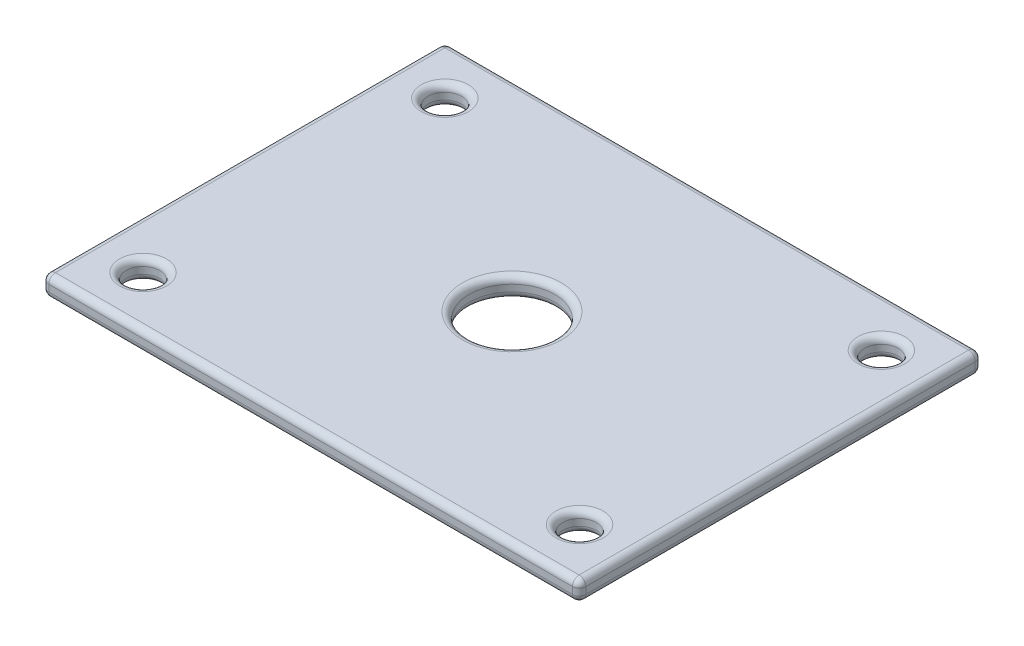
ISO-10303-21;
HEADER;
FILE_DESCRIPTION(('STEP AP214'),'2;1');
FILE_NAME('part.step','',(''),(''),'','','');
FILE_SCHEMA(('AUTOMOTIVE_DESIGN { 1 0 10303 214 1 1 1 1 }'));
ENDSEC;
DATA;
#1=APPLICATION_CONTEXT('core data for automotive mechanical design processes');
#2=APPLICATION_PROTOCOL_DEFINITION('international standard','automotive_design',2000,#1);
#3=PRODUCT_CONTEXT('',#1,'mechanical');
#4=PRODUCT('Part','Part','',(#3));
#5=PRODUCT_RELATED_PRODUCT_CATEGORY('part','',(#4));
#6=PRODUCT_DEFINITION_FORMATION('','',#4);
#7=PRODUCT_DEFINITION_CONTEXT('part definition',#1,'design');
#8=PRODUCT_DEFINITION('design','',#6,#7);
#9=PRODUCT_DEFINITION_SHAPE('','',#8);
#10=(LENGTH_UNIT() NAMED_UNIT(*) SI_UNIT(.MILLI.,.METRE.));
#11=(NAMED_UNIT(*) PLANE_ANGLE_UNIT() SI_UNIT($,.RADIAN.));
#12=(NAMED_UNIT(*) SI_UNIT($,.STERADIAN.) SOLID_ANGLE_UNIT());
#13=UNCERTAINTY_MEASURE_WITH_UNIT(LENGTH_MEASURE(1.E-05),#10,'distance_accuracy_value','');
#14=(GEOMETRIC_REPRESENTATION_CONTEXT(3) GLOBAL_UNCERTAINTY_ASSIGNED_CONTEXT((#13)) GLOBAL_UNIT_ASSIGNED_CONTEXT((#10,
#11,#12)) REPRESENTATION_CONTEXT('',''));
#15=CARTESIAN_POINT('',(0.,0.,0.));
#16=DIRECTION('',(0.,0.,1.));
#17=DIRECTION('',(1.,0.,0.));
#18=AXIS2_PLACEMENT_3D('',#15,#16,#17);
#19=CARTESIAN_POINT('',(-25.8676480428237,3.,-8.16326530612245));
#20=DIRECTION('',(1.,0.,0.));
#21=DIRECTION('',(0.,0.,-1.));
#22=AXIS2_PLACEMENT_3D('',#19,#20,#21);
#23=PLANE('',#22);
#24=DIRECTION('',(0.,0.,1.));
#25=VECTOR('',#24,1.);
#26=CARTESIAN_POINT('',(-25.8676480428237,2.,-8.16326530612245));
#27=LINE('',#26,#25);
#28=CARTESIAN_POINT('',(-25.8676480428236,2.,50.8367346938775));
#29=VERTEX_POINT('',#28);
#30=CARTESIAN_POINT('',(-25.8676480428237,2.,-7.16326530612245));
#31=VERTEX_POINT('',#30);
#32=EDGE_CURVE('E239',#29,#31,#27,.F.);
#33=ORIENTED_EDGE('',*,*,#32,.T.);
#34=DIRECTION('',(0.,-1.,0.));
#35=VECTOR('',#34,1.);
#36=CARTESIAN_POINT('',(-25.8676480428237,3.,-7.16326530612245));
#37=LINE('',#36,#35);
#38=CARTESIAN_POINT('',(-25.8676480428237,1.,-7.16326530612245));
#39=VERTEX_POINT('',#38);
#40=EDGE_CURVE('E246',#31,#39,#37,.T.);
#41=ORIENTED_EDGE('',*,*,#40,.T.);
#42=DIRECTION('',(0.,0.,1.));
#43=VECTOR('',#42,1.);
#44=CARTESIAN_POINT('',(-25.8676480428237,1.,-8.16326530612245));
#45=LINE('',#44,#43);
#46=CARTESIAN_POINT('',(-25.8676480428236,1.,50.8367346938775));
#47=VERTEX_POINT('',#46);
#48=EDGE_CURVE('E242',#39,#47,#45,.T.);
#49=ORIENTED_EDGE('',*,*,#48,.T.);
#50=DIRECTION('',(0.,-1.,0.));
#51=VECTOR('',#50,1.);
#52=CARTESIAN_POINT('',(-25.8676480428236,3.,50.8367346938775));
#53=LINE('',#52,#51);
#54=EDGE_CURVE('E236',#47,#29,#53,.F.);
#55=ORIENTED_EDGE('',*,*,#54,.T.);
#56=EDGE_LOOP('',(#33,#41,#49,#55));
#57=FACE_BOUND('',#56,.T.);
#58=ADVANCED_FACE('F45',(#57),#23,.F.);
#59=CARTESIAN_POINT('',(-25.8676480428236,3.,51.8367346938775));
#60=DIRECTION('',(0.,0.,-1.));
#61=DIRECTION('',(-1.,0.,0.));
#62=AXIS2_PLACEMENT_3D('',#59,#60,#61);
#63=PLANE('',#62);
#64=DIRECTION('',(1.,0.,0.));
#65=VECTOR('',#64,1.);
#66=CARTESIAN_POINT('',(-25.8676480428236,2.,51.8367346938775));
#67=LINE('',#66,#65);
#68=CARTESIAN_POINT('',(53.1323519571764,2.,51.8367346938775));
#69=VERTEX_POINT('',#68);
#70=CARTESIAN_POINT('',(-24.8676480428236,2.,51.8367346938775));
#71=VERTEX_POINT('',#70);
#72=EDGE_CURVE('E166',#69,#71,#67,.F.);
#73=ORIENTED_EDGE('',*,*,#72,.T.);
#74=DIRECTION('',(0.,-1.,0.));
#75=VECTOR('',#74,1.);
#76=CARTESIAN_POINT('',(-24.8676480428236,3.,51.8367346938775));
#77=LINE('',#76,#75);
#78=CARTESIAN_POINT('',(-24.8676480428236,1.,51.8367346938775));
#79=VERTEX_POINT('',#78);
#80=EDGE_CURVE('E170',#71,#79,#77,.T.);
#81=ORIENTED_EDGE('',*,*,#80,.T.);
#82=DIRECTION('',(1.,0.,0.));
#83=VECTOR('',#82,1.);
#84=CARTESIAN_POINT('',(-25.8676480428236,1.,51.8367346938775));
#85=LINE('',#84,#83);
#86=CARTESIAN_POINT('',(53.1323519571764,1.,51.8367346938775));
#87=VERTEX_POINT('',#86);
#88=EDGE_CURVE('E139',#79,#87,#85,.T.);
#89=ORIENTED_EDGE('',*,*,#88,.T.);
#90=DIRECTION('',(0.,-1.,0.));
#91=VECTOR('',#90,1.);
#92=CARTESIAN_POINT('',(53.1323519571764,3.,51.8367346938775));
#93=LINE('',#92,#91);
#94=EDGE_CURVE('E159',#87,#69,#93,.F.);
#95=ORIENTED_EDGE('',*,*,#94,.T.);
#96=EDGE_LOOP('',(#73,#81,#89,#95));
#97=FACE_BOUND('',#96,.T.);
#98=ADVANCED_FACE('F168',(#97),#63,.F.);
#99=CARTESIAN_POINT('',(54.1323519571764,3.,-8.16326530612245));
#100=DIRECTION('',(-1.,0.,0.));
#101=DIRECTION('',(0.,0.,1.));
#102=AXIS2_PLACEMENT_3D('',#99,#100,#101);
#103=PLANE('',#102);
#104=DIRECTION('',(0.,0.,-1.));
#105=VECTOR('',#104,1.);
#106=CARTESIAN_POINT('',(54.1323519571764,2.,51.8367346938775));
#107=LINE('',#106,#105);
#108=CARTESIAN_POINT('',(54.1323519571764,2.,-7.16326530612245));
#109=VERTEX_POINT('',#108);
#110=CARTESIAN_POINT('',(54.1323519571764,2.,50.8367346938775));
#111=VERTEX_POINT('',#110);
#112=EDGE_CURVE('E213',#109,#111,#107,.F.);
#113=ORIENTED_EDGE('',*,*,#112,.T.);
#114=DIRECTION('',(0.,-1.,0.));
#115=VECTOR('',#114,1.);
#116=CARTESIAN_POINT('',(54.1323519571764,3.,50.8367346938775));
#117=LINE('',#116,#115);
#118=CARTESIAN_POINT('',(54.1323519571764,1.,50.8367346938775));
#119=VERTEX_POINT('',#118);
#120=EDGE_CURVE('E220',#111,#119,#117,.T.);
#121=ORIENTED_EDGE('',*,*,#120,.T.);
#122=DIRECTION('',(0.,0.,-1.));
#123=VECTOR('',#122,1.);
#124=CARTESIAN_POINT('',(54.1323519571764,1.,-8.16326530612245));
#125=LINE('',#124,#123);
#126=CARTESIAN_POINT('',(54.1323519571764,1.,-7.16326530612245));
#127=VERTEX_POINT('',#126);
#128=EDGE_CURVE('E216',#119,#127,#125,.T.);
#129=ORIENTED_EDGE('',*,*,#128,.T.);
#130=DIRECTION('',(0.,-1.,0.));
#131=VECTOR('',#130,1.);
#132=CARTESIAN_POINT('',(54.1323519571764,3.,-7.16326530612245));
#133=LINE('',#132,#131);
#134=EDGE_CURVE('E210',#127,#109,#133,.F.);
#135=ORIENTED_EDGE('',*,*,#134,.T.);
#136=EDGE_LOOP('',(#113,#121,#129,#135));
#137=FACE_BOUND('',#136,.T.);
#138=ADVANCED_FACE('F468',(#137),#103,.F.);
#139=CARTESIAN_POINT('',(-25.8676480428237,3.,-8.16326530612245));
#140=DIRECTION('',(0.,0.,1.));
#141=DIRECTION('',(1.,0.,0.));
#142=AXIS2_PLACEMENT_3D('',#139,#140,#141);
#143=PLANE('',#142);
#144=DIRECTION('',(-1.,0.,0.));
#145=VECTOR('',#144,1.);
#146=CARTESIAN_POINT('',(-25.8676480428237,1.,-8.16326530612245));
#147=LINE('',#146,#145);
#148=CARTESIAN_POINT('',(53.1323519571764,1.,-8.16326530612245));
#149=VERTEX_POINT('',#148);
#150=CARTESIAN_POINT('',(-24.8676480428237,1.,-8.16326530612245));
#151=VERTEX_POINT('',#150);
#152=EDGE_CURVE('E229',#149,#151,#147,.T.);
#153=ORIENTED_EDGE('',*,*,#152,.T.);
#154=DIRECTION('',(0.,-1.,0.));
#155=VECTOR('',#154,1.);
#156=CARTESIAN_POINT('',(-24.8676480428237,3.,-8.16326530612245));
#157=LINE('',#156,#155);
#158=CARTESIAN_POINT('',(-24.8676480428237,2.,-8.16326530612245));
#159=VERTEX_POINT('',#158);
#160=EDGE_CURVE('E233',#151,#159,#157,.F.);
#161=ORIENTED_EDGE('',*,*,#160,.T.);
#162=DIRECTION('',(-1.,0.,0.));
#163=VECTOR('',#162,1.);
#164=CARTESIAN_POINT('',(54.1323519571764,2.,-8.16326530612245));
#165=LINE('',#164,#163);
#166=CARTESIAN_POINT('',(53.1323519571764,2.,-8.16326530612245));
#167=VERTEX_POINT('',#166);
#168=EDGE_CURVE('E226',#159,#167,#165,.F.);
#169=ORIENTED_EDGE('',*,*,#168,.T.);
#170=DIRECTION('',(0.,-1.,0.));
#171=VECTOR('',#170,1.);
#172=CARTESIAN_POINT('',(53.1323519571764,3.,-8.16326530612245));
#173=LINE('',#172,#171);
#174=EDGE_CURVE('E223',#167,#149,#173,.T.);
#175=ORIENTED_EDGE('',*,*,#174,.T.);
#176=EDGE_LOOP('',(#153,#161,#169,#175));
#177=FACE_BOUND('',#176,.T.);
#178=ADVANCED_FACE('F435',(#177),#143,.F.);
#179=CARTESIAN_POINT('',(0.,3.,0.));
#180=DIRECTION('',(0.,1.,0.));
#181=DIRECTION('',(0.,0.,1.));
#182=AXIS2_PLACEMENT_3D('',#179,#180,#181);
#183=PLANE('',#182);
#184=DIRECTION('',(0.,0.,-1.));
#185=VECTOR('',#184,1.);
#186=CARTESIAN_POINT('',(53.1323519571764,3.,-8.16326530612245));
#187=LINE('',#186,#185);
#188=CARTESIAN_POINT('',(53.1323519571764,3.,50.8367346938775));
#189=VERTEX_POINT('',#188);
#190=CARTESIAN_POINT('',(53.1323519571764,3.,-7.16326530612245));
#191=VERTEX_POINT('',#190);
#192=EDGE_CURVE('E55',#189,#191,#187,.T.);
#193=ORIENTED_EDGE('',*,*,#192,.T.);
#194=DIRECTION('',(-1.,0.,0.));
#195=VECTOR('',#194,1.);
#196=CARTESIAN_POINT('',(-25.8676480428237,3.,-7.16326530612245));
#197=LINE('',#196,#195);
#198=CARTESIAN_POINT('',(-24.8676480428237,3.,-7.16326530612245));
#199=VERTEX_POINT('',#198);
#200=EDGE_CURVE('E11',#191,#199,#197,.T.);
#201=ORIENTED_EDGE('',*,*,#200,.T.);
#202=DIRECTION('',(0.,0.,1.));
#203=VECTOR('',#202,1.);
#204=CARTESIAN_POINT('',(-24.8676480428236,3.,51.8367346938775));
#205=LINE('',#204,#203);
#206=CARTESIAN_POINT('',(-24.8676480428236,3.,50.8367346938775));
#207=VERTEX_POINT('',#206);
#208=EDGE_CURVE('E309',#199,#207,#205,.T.);
#209=ORIENTED_EDGE('',*,*,#208,.T.);
#210=DIRECTION('',(1.,0.,0.));
#211=VECTOR('',#210,1.);
#212=CARTESIAN_POINT('',(54.1323519571764,3.,50.8367346938775));
#213=LINE('',#212,#211);
#214=EDGE_CURVE('E66',#207,#189,#213,.T.);
#215=ORIENTED_EDGE('',*,*,#214,.T.);
#216=EDGE_LOOP('',(#193,#201,#209,#215));
#217=FACE_BOUND('',#216,.T.);
#218=CARTESIAN_POINT('',(-18.3676480428237,3.,-0.66326530612245));
#219=DIRECTION('',(0.,1.,0.));
#220=DIRECTION('',(0.,0.,1.));
#221=AXIS2_PLACEMENT_3D('',#218,#219,#220);
#222=CIRCLE('',#221,3.5);
#223=CARTESIAN_POINT('',(-18.3676480428237,3.,2.83673469387755));
#224=VERTEX_POINT('',#223);
#225=EDGE_CURVE('E305',#224,#224,#222,.F.);
#226=ORIENTED_EDGE('',*,*,#225,.T.);
#227=EDGE_LOOP('',(#226));
#228=FACE_BOUND('',#227,.T.);
#229=CARTESIAN_POINT('',(14.1323519571763,3.,21.8367346938775));
#230=DIRECTION('',(0.,1.,0.));
#231=DIRECTION('',(0.,0.,1.));
#232=AXIS2_PLACEMENT_3D('',#229,#230,#231);
#233=CIRCLE('',#232,7.375);
#234=CARTESIAN_POINT('',(14.1323519571763,3.,29.2117346938775));
#235=VERTEX_POINT('',#234);
#236=EDGE_CURVE('E301',#235,#235,#233,.F.);
#237=ORIENTED_EDGE('',*,*,#236,.T.);
#238=EDGE_LOOP('',(#237));
#239=FACE_BOUND('',#238,.T.);
#240=CARTESIAN_POINT('',(46.6563519571763,3.,-0.66326530612245));
#241=DIRECTION('',(0.,1.,0.));
#242=DIRECTION('',(0.,0.,1.));
#243=AXIS2_PLACEMENT_3D('',#240,#241,#242);
#244=CIRCLE('',#243,3.5);
#245=CARTESIAN_POINT('',(46.6563519571763,3.,2.83673469387755));
#246=VERTEX_POINT('',#245);
#247=EDGE_CURVE('E297',#246,#246,#244,.F.);
#248=ORIENTED_EDGE('',*,*,#247,.T.);
#249=EDGE_LOOP('',(#248));
#250=FACE_BOUND('',#249,.T.);
#251=CARTESIAN_POINT('',(46.6563519571768,3.,44.2947346938776));
#252=DIRECTION('',(0.,1.,0.));
#253=DIRECTION('',(0.,0.,1.));
#254=AXIS2_PLACEMENT_3D('',#251,#252,#253);
#255=CIRCLE('',#254,3.5);
#256=CARTESIAN_POINT('',(46.6563519571768,3.,47.7947346938776));
#257=VERTEX_POINT('',#256);
#258=EDGE_CURVE('E293',#257,#257,#255,.F.);
#259=ORIENTED_EDGE('',*,*,#258,.T.);
#260=EDGE_LOOP('',(#259));
#261=FACE_BOUND('',#260,.T.);
#262=CARTESIAN_POINT('',(-18.3676480428232,3.,44.2947346938776));
#263=DIRECTION('',(0.,1.,0.));
#264=DIRECTION('',(0.,0.,1.));
#265=AXIS2_PLACEMENT_3D('',#262,#263,#264);
#266=CIRCLE('',#265,3.5);
#267=CARTESIAN_POINT('',(-18.3676480428232,3.,47.7947346938776));
#268=VERTEX_POINT('',#267);
#269=EDGE_CURVE('E289',#268,#268,#266,.F.);
#270=ORIENTED_EDGE('',*,*,#269,.T.);
#271=EDGE_LOOP('',(#270));
#272=FACE_BOUND('',#271,.T.);
#273=ADVANCED_FACE('F414',(#217,#228,#239,#250,#261,#272),#183,.T.);
#274=CARTESIAN_POINT('',(0.,0.,0.));
#275=DIRECTION('',(0.,1.,0.));
#276=DIRECTION('',(0.,0.,1.));
#277=AXIS2_PLACEMENT_3D('',#274,#275,#276);
#278=PLANE('',#277);
#279=DIRECTION('',(0.,0.,-1.));
#280=VECTOR('',#279,1.);
#281=CARTESIAN_POINT('',(53.1323519571764,0.,0.));
#282=LINE('',#281,#280);
#283=CARTESIAN_POINT('',(53.1323519571764,0.,-7.16326530612245));
#284=VERTEX_POINT('',#283);
#285=CARTESIAN_POINT('',(53.1323519571764,0.,50.8367346938775));
#286=VERTEX_POINT('',#285);
#287=EDGE_CURVE('E205',#284,#286,#282,.F.);
#288=ORIENTED_EDGE('',*,*,#287,.T.);
#289=DIRECTION('',(1.,0.,0.));
#290=VECTOR('',#289,1.);
#291=CARTESIAN_POINT('',(0.,0.,50.8367346938775));
#292=LINE('',#291,#290);
#293=CARTESIAN_POINT('',(-24.8676480428236,0.,50.8367346938775));
#294=VERTEX_POINT('',#293);
#295=EDGE_CURVE('E141',#286,#294,#292,.F.);
#296=ORIENTED_EDGE('',*,*,#295,.T.);
#297=DIRECTION('',(0.,0.,1.));
#298=VECTOR('',#297,1.);
#299=CARTESIAN_POINT('',(-24.8676480428237,0.,0.));
#300=LINE('',#299,#298);
#301=CARTESIAN_POINT('',(-24.8676480428237,0.,-7.16326530612245));
#302=VERTEX_POINT('',#301);
#303=EDGE_CURVE('E199',#294,#302,#300,.F.);
#304=ORIENTED_EDGE('',*,*,#303,.T.);
#305=DIRECTION('',(-1.,0.,0.));
#306=VECTOR('',#305,1.);
#307=CARTESIAN_POINT('',(0.,0.,-7.16326530612245));
#308=LINE('',#307,#306);
#309=EDGE_CURVE('E202',#302,#284,#308,.F.);
#310=ORIENTED_EDGE('',*,*,#309,.T.);
#311=EDGE_LOOP('',(#288,#296,#304,#310));
#312=FACE_BOUND('',#311,.T.);
#313=CARTESIAN_POINT('',(-18.3676480428237,0.,-0.66326530612245));
#314=DIRECTION('',(0.,1.,0.));
#315=DIRECTION('',(0.,0.,1.));
#316=AXIS2_PLACEMENT_3D('',#313,#314,#315);
#317=CIRCLE('',#316,3.5);
#318=CARTESIAN_POINT('',(-18.3676480428237,0.,2.83673469387755));
#319=VERTEX_POINT('',#318);
#320=EDGE_CURVE('E195',#319,#319,#317,.T.);
#321=ORIENTED_EDGE('',*,*,#320,.T.);
#322=EDGE_LOOP('',(#321));
#323=FACE_BOUND('',#322,.T.);
#324=CARTESIAN_POINT('',(14.1323519571763,0.,21.8367346938775));
#325=DIRECTION('',(0.,1.,0.));
#326=DIRECTION('',(0.,0.,1.));
#327=AXIS2_PLACEMENT_3D('',#324,#325,#326);
#328=CIRCLE('',#327,7.375);
#329=CARTESIAN_POINT('',(14.1323519571763,0.,29.2117346938775));
#330=VERTEX_POINT('',#329);
#331=EDGE_CURVE('E191',#330,#330,#328,.T.);
#332=ORIENTED_EDGE('',*,*,#331,.T.);
#333=EDGE_LOOP('',(#332));
#334=FACE_BOUND('',#333,.T.);
#335=CARTESIAN_POINT('',(46.6563519571763,0.,-0.66326530612245));
#336=DIRECTION('',(0.,1.,0.));
#337=DIRECTION('',(0.,0.,1.));
#338=AXIS2_PLACEMENT_3D('',#335,#336,#337);
#339=CIRCLE('',#338,3.5);
#340=CARTESIAN_POINT('',(46.6563519571763,0.,2.83673469387755));
#341=VERTEX_POINT('',#340);
#342=EDGE_CURVE('E187',#341,#341,#339,.T.);
#343=ORIENTED_EDGE('',*,*,#342,.T.);
#344=EDGE_LOOP('',(#343));
#345=FACE_BOUND('',#344,.T.);
#346=CARTESIAN_POINT('',(46.6563519571768,0.,44.2947346938776));
#347=DIRECTION('',(0.,1.,0.));
#348=DIRECTION('',(0.,0.,1.));
#349=AXIS2_PLACEMENT_3D('',#346,#347,#348);
#350=CIRCLE('',#349,3.5);
#351=CARTESIAN_POINT('',(46.6563519571768,0.,47.7947346938776));
#352=VERTEX_POINT('',#351);
#353=EDGE_CURVE('E183',#352,#352,#350,.T.);
#354=ORIENTED_EDGE('',*,*,#353,.T.);
#355=EDGE_LOOP('',(#354));
#356=FACE_BOUND('',#355,.T.);
#357=CARTESIAN_POINT('',(-18.3676480428232,0.,44.2947346938776));
#358=DIRECTION('',(0.,1.,0.));
#359=DIRECTION('',(0.,0.,1.));
#360=AXIS2_PLACEMENT_3D('',#357,#358,#359);
#361=CIRCLE('',#360,3.5);
#362=CARTESIAN_POINT('',(-18.3676480428232,0.,47.7947346938776));
#363=VERTEX_POINT('',#362);
#364=EDGE_CURVE('E176',#363,#363,#361,.T.);
#365=ORIENTED_EDGE('',*,*,#364,.T.);
#366=EDGE_LOOP('',(#365));
#367=FACE_BOUND('',#366,.T.);
#368=ADVANCED_FACE('F497',(#312,#323,#334,#345,#356,#367),#278,.F.);
#369=CARTESIAN_POINT('',(-18.3676480428237,0.,-0.66326530612245));
#370=DIRECTION('',(0.,1.,0.));
#371=DIRECTION('',(0.,0.,1.));
#372=AXIS2_PLACEMENT_3D('',#369,#370,#371);
#373=CYLINDRICAL_SURFACE('',#372,2.5);
#374=CARTESIAN_POINT('',(-18.3676480428237,1.,-0.66326530612245));
#375=DIRECTION('',(0.,1.,0.));
#376=DIRECTION('',(0.,0.,1.));
#377=AXIS2_PLACEMENT_3D('',#374,#375,#376);
#378=CIRCLE('',#377,2.5);
#379=CARTESIAN_POINT('',(-18.3676480428237,1.,1.83673469387755));
#380=VERTEX_POINT('',#379);
#381=EDGE_CURVE('E253',#380,#380,#378,.F.);
#382=ORIENTED_EDGE('',*,*,#381,.T.);
#383=EDGE_LOOP('',(#382));
#384=FACE_BOUND('',#383,.T.);
#385=CARTESIAN_POINT('',(-18.3676480428237,2.,-0.66326530612245));
#386=DIRECTION('',(0.,1.,0.));
#387=DIRECTION('',(0.,0.,1.));
#388=AXIS2_PLACEMENT_3D('',#385,#386,#387);
#389=CIRCLE('',#388,2.5);
#390=CARTESIAN_POINT('',(-18.3676480428237,2.,1.83673469387755));
#391=VERTEX_POINT('',#390);
#392=EDGE_CURVE('E249',#391,#391,#389,.T.);
#393=ORIENTED_EDGE('',*,*,#392,.T.);
#394=EDGE_LOOP('',(#393));
#395=FACE_BOUND('',#394,.T.);
#396=ADVANCED_FACE('F500',(#384,#395),#373,.F.);
#397=CARTESIAN_POINT('',(14.1323519571763,0.,21.8367346938775));
#398=DIRECTION('',(0.,1.,0.));
#399=DIRECTION('',(0.,0.,1.));
#400=AXIS2_PLACEMENT_3D('',#397,#398,#399);
#401=CYLINDRICAL_SURFACE('',#400,6.375);
#402=CARTESIAN_POINT('',(14.1323519571763,1.,21.8367346938775));
#403=DIRECTION('',(0.,1.,0.));
#404=DIRECTION('',(0.,0.,1.));
#405=AXIS2_PLACEMENT_3D('',#402,#403,#404);
#406=CIRCLE('',#405,6.375);
#407=CARTESIAN_POINT('',(14.1323519571763,1.,28.2117346938775));
#408=VERTEX_POINT('',#407);
#409=EDGE_CURVE('E261',#408,#408,#406,.F.);
#410=ORIENTED_EDGE('',*,*,#409,.T.);
#411=EDGE_LOOP('',(#410));
#412=FACE_BOUND('',#411,.T.);
#413=CARTESIAN_POINT('',(14.1323519571763,2.,21.8367346938775));
#414=DIRECTION('',(0.,1.,0.));
#415=DIRECTION('',(0.,0.,1.));
#416=AXIS2_PLACEMENT_3D('',#413,#414,#415);
#417=CIRCLE('',#416,6.375);
#418=CARTESIAN_POINT('',(14.1323519571763,2.,28.2117346938775));
#419=VERTEX_POINT('',#418);
#420=EDGE_CURVE('E257',#419,#419,#417,.T.);
#421=ORIENTED_EDGE('',*,*,#420,.T.);
#422=EDGE_LOOP('',(#421));
#423=FACE_BOUND('',#422,.T.);
#424=ADVANCED_FACE('F561',(#412,#423),#401,.F.);
#425=CARTESIAN_POINT('',(46.6563519571763,0.,-0.66326530612245));
#426=DIRECTION('',(0.,1.,0.));
#427=DIRECTION('',(0.,0.,1.));
#428=AXIS2_PLACEMENT_3D('',#425,#426,#427);
#429=CYLINDRICAL_SURFACE('',#428,2.5);
#430=CARTESIAN_POINT('',(46.6563519571763,1.,-0.66326530612245));
#431=DIRECTION('',(0.,1.,0.));
#432=DIRECTION('',(0.,0.,1.));
#433=AXIS2_PLACEMENT_3D('',#430,#431,#432);
#434=CIRCLE('',#433,2.5);
#435=CARTESIAN_POINT('',(46.6563519571763,1.,1.83673469387755));
#436=VERTEX_POINT('',#435);
#437=EDGE_CURVE('E269',#436,#436,#434,.F.);
#438=ORIENTED_EDGE('',*,*,#437,.T.);
#439=EDGE_LOOP('',(#438));
#440=FACE_BOUND('',#439,.T.);
#441=CARTESIAN_POINT('',(46.6563519571763,2.,-0.66326530612245));
#442=DIRECTION('',(0.,1.,0.));
#443=DIRECTION('',(0.,0.,1.));
#444=AXIS2_PLACEMENT_3D('',#441,#442,#443);
#445=CIRCLE('',#444,2.5);
#446=CARTESIAN_POINT('',(46.6563519571763,2.,1.83673469387755));
#447=VERTEX_POINT('',#446);
#448=EDGE_CURVE('E265',#447,#447,#445,.T.);
#449=ORIENTED_EDGE('',*,*,#448,.T.);
#450=EDGE_LOOP('',(#449));
#451=FACE_BOUND('',#450,.T.);
#452=ADVANCED_FACE('F551',(#440,#451),#429,.F.);
#453=CARTESIAN_POINT('',(46.6563519571768,0.,44.2947346938776));
#454=DIRECTION('',(0.,1.,0.));
#455=DIRECTION('',(0.,0.,1.));
#456=AXIS2_PLACEMENT_3D('',#453,#454,#455);
#457=CYLINDRICAL_SURFACE('',#456,2.5);
#458=CARTESIAN_POINT('',(46.6563519571768,1.,44.2947346938776));
#459=DIRECTION('',(0.,1.,0.));
#460=DIRECTION('',(0.,0.,1.));
#461=AXIS2_PLACEMENT_3D('',#458,#459,#460);
#462=CIRCLE('',#461,2.5);
#463=CARTESIAN_POINT('',(46.6563519571768,1.,46.7947346938776));
#464=VERTEX_POINT('',#463);
#465=EDGE_CURVE('E277',#464,#464,#462,.F.);
#466=ORIENTED_EDGE('',*,*,#465,.T.);
#467=EDGE_LOOP('',(#466));
#468=FACE_BOUND('',#467,.T.);
#469=CARTESIAN_POINT('',(46.6563519571768,2.,44.2947346938776));
#470=DIRECTION('',(0.,1.,0.));
#471=DIRECTION('',(0.,0.,1.));
#472=AXIS2_PLACEMENT_3D('',#469,#470,#471);
#473=CIRCLE('',#472,2.5);
#474=CARTESIAN_POINT('',(46.6563519571768,2.,46.7947346938776));
#475=VERTEX_POINT('',#474);
#476=EDGE_CURVE('E273',#475,#475,#473,.T.);
#477=ORIENTED_EDGE('',*,*,#476,.T.);
#478=EDGE_LOOP('',(#477));
#479=FACE_BOUND('',#478,.T.);
#480=ADVANCED_FACE('F548',(#468,#479),#457,.F.);
#481=CARTESIAN_POINT('',(-18.3676480428232,0.,44.2947346938776));
#482=DIRECTION('',(0.,1.,0.));
#483=DIRECTION('',(0.,0.,1.));
#484=AXIS2_PLACEMENT_3D('',#481,#482,#483);
#485=CYLINDRICAL_SURFACE('',#484,2.5);
#486=CARTESIAN_POINT('',(-18.3676480428232,1.,44.2947346938776));
#487=DIRECTION('',(0.,1.,0.));
#488=DIRECTION('',(0.,0.,1.));
#489=AXIS2_PLACEMENT_3D('',#486,#487,#488);
#490=CIRCLE('',#489,2.5);
#491=CARTESIAN_POINT('',(-18.3676480428232,1.,46.7947346938776));
#492=VERTEX_POINT('',#491);
#493=EDGE_CURVE('E285',#492,#492,#490,.F.);
#494=ORIENTED_EDGE('',*,*,#493,.T.);
#495=EDGE_LOOP('',(#494));
#496=FACE_BOUND('',#495,.T.);
#497=CARTESIAN_POINT('',(-18.3676480428232,2.,44.2947346938776));
#498=DIRECTION('',(0.,1.,0.));
#499=DIRECTION('',(0.,0.,1.));
#500=AXIS2_PLACEMENT_3D('',#497,#498,#499);
#501=CIRCLE('',#500,2.5);
#502=CARTESIAN_POINT('',(-18.3676480428232,2.,46.7947346938776));
#503=VERTEX_POINT('',#502);
#504=EDGE_CURVE('E281',#503,#503,#501,.T.);
#505=ORIENTED_EDGE('',*,*,#504,.T.);
#506=EDGE_LOOP('',(#505));
#507=FACE_BOUND('',#506,.T.);
#508=ADVANCED_FACE('F550',(#496,#507),#485,.F.);
#509=CARTESIAN_POINT('',(0.,2.,-7.16326530612245));
#510=DIRECTION('',(1.,0.,0.));
#511=DIRECTION('',(0.,0.,-1.));
#512=AXIS2_PLACEMENT_3D('',#509,#510,#511);
#513=CYLINDRICAL_SURFACE('',#512,1.);
#514=CARTESIAN_POINT('',(-24.8676480428237,2.,-7.16326530612245));
#515=DIRECTION('',(-1.,0.,0.));
#516=DIRECTION('',(0.,0.,1.));
#517=AXIS2_PLACEMENT_3D('',#514,#515,#516);
#518=CIRCLE('',#517,1.);
#519=EDGE_CURVE('E49',#199,#159,#518,.T.);
#520=ORIENTED_EDGE('',*,*,#519,.F.);
#521=ORIENTED_EDGE('',*,*,#200,.F.);
#522=CARTESIAN_POINT('',(53.1323519571764,2.,-7.16326530612245));
#523=DIRECTION('',(1.,0.,0.));
#524=DIRECTION('',(0.,1.,0.));
#525=AXIS2_PLACEMENT_3D('',#522,#523,#524);
#526=CIRCLE('',#525,1.);
#527=EDGE_CURVE('E385',#167,#191,#526,.T.);
#528=ORIENTED_EDGE('',*,*,#527,.F.);
#529=ORIENTED_EDGE('',*,*,#168,.F.);
#530=EDGE_LOOP('',(#520,#521,#528,#529));
#531=FACE_BOUND('',#530,.T.);
#532=ADVANCED_FACE('F558',(#531),#513,.T.);
#533=CARTESIAN_POINT('',(-24.8676480428237,2.,-7.16326530612245));
#534=DIRECTION('',(0.,0.,1.));
#535=DIRECTION('',(1.,0.,0.));
#536=AXIS2_PLACEMENT_3D('',#533,#534,#535);
#537=SPHERICAL_SURFACE('',#536,1.);
#538=CARTESIAN_POINT('',(-24.8676480428237,2.,-7.16326530612245));
#539=DIRECTION('',(0.,0.,-1.));
#540=DIRECTION('',(-1.,0.,0.));
#541=AXIS2_PLACEMENT_3D('',#538,#539,#540);
#542=CIRCLE('',#541,1.);
#543=EDGE_CURVE('E378',#199,#31,#542,.F.);
#544=ORIENTED_EDGE('',*,*,#543,.F.);
#545=ORIENTED_EDGE('',*,*,#519,.T.);
#546=CARTESIAN_POINT('',(-24.8676480428237,2.,-7.16326530612245));
#547=DIRECTION('',(0.,1.,0.));
#548=DIRECTION('',(0.,0.,1.));
#549=AXIS2_PLACEMENT_3D('',#546,#547,#548);
#550=CIRCLE('',#549,1.);
#551=EDGE_CURVE('E382',#31,#159,#550,.F.);
#552=ORIENTED_EDGE('',*,*,#551,.F.);
#553=EDGE_LOOP('',(#544,#545,#552));
#554=FACE_BOUND('',#553,.T.);
#555=ADVANCED_FACE('F398',(#554),#537,.T.);
#556=CARTESIAN_POINT('',(53.1323519571764,2.,-7.16326530612245));
#557=DIRECTION('',(0.,0.,1.));
#558=DIRECTION('',(1.,0.,0.));
#559=AXIS2_PLACEMENT_3D('',#556,#557,#558);
#560=SPHERICAL_SURFACE('',#559,1.);
#561=CARTESIAN_POINT('',(53.1323519571764,2.,-7.16326530612245));
#562=DIRECTION('',(0.,1.,0.));
#563=DIRECTION('',(0.,0.,1.));
#564=AXIS2_PLACEMENT_3D('',#561,#562,#563);
#565=CIRCLE('',#564,1.);
#566=EDGE_CURVE('E370',#167,#109,#565,.F.);
#567=ORIENTED_EDGE('',*,*,#566,.F.);
#568=ORIENTED_EDGE('',*,*,#527,.T.);
#569=CARTESIAN_POINT('',(53.1323519571764,2.,-7.16326530612245));
#570=DIRECTION('',(0.,0.,-1.));
#571=DIRECTION('',(-1.,0.,0.));
#572=AXIS2_PLACEMENT_3D('',#569,#570,#571);
#573=CIRCLE('',#572,1.);
#574=EDGE_CURVE('E374',#109,#191,#573,.F.);
#575=ORIENTED_EDGE('',*,*,#574,.F.);
#576=EDGE_LOOP('',(#567,#568,#575));
#577=FACE_BOUND('',#576,.T.);
#578=ADVANCED_FACE('F427',(#577),#560,.T.);
#579=CARTESIAN_POINT('',(-24.8676480428237,3.,-7.16326530612245));
#580=DIRECTION('',(0.,-1.,0.));
#581=DIRECTION('',(0.,0.,-1.));
#582=AXIS2_PLACEMENT_3D('',#579,#580,#581);
#583=CYLINDRICAL_SURFACE('',#582,1.);
#584=ORIENTED_EDGE('',*,*,#551,.T.);
#585=ORIENTED_EDGE('',*,*,#160,.F.);
#586=CARTESIAN_POINT('',(-24.8676480428237,1.,-7.16326530612245));
#587=DIRECTION('',(0.,-1.,0.));
#588=DIRECTION('',(0.,0.,-1.));
#589=AXIS2_PLACEMENT_3D('',#586,#587,#588);
#590=CIRCLE('',#589,1.);
#591=EDGE_CURVE('E363',#39,#151,#590,.T.);
#592=ORIENTED_EDGE('',*,*,#591,.F.);
#593=ORIENTED_EDGE('',*,*,#40,.F.);
#594=EDGE_LOOP('',(#584,#585,#592,#593));
#595=FACE_BOUND('',#594,.T.);
#596=ADVANCED_FACE('F404',(#595),#583,.T.);
#597=CARTESIAN_POINT('',(-24.8676480428237,2.,0.));
#598=DIRECTION('',(0.,0.,-1.));
#599=DIRECTION('',(-1.,0.,0.));
#600=AXIS2_PLACEMENT_3D('',#597,#598,#599);
#601=CYLINDRICAL_SURFACE('',#600,1.);
#602=ORIENTED_EDGE('',*,*,#543,.T.);
#603=ORIENTED_EDGE('',*,*,#32,.F.);
#604=CARTESIAN_POINT('',(-24.8676480428236,2.,50.8367346938775));
#605=DIRECTION('',(0.,0.,1.));
#606=DIRECTION('',(1.,0.,0.));
#607=AXIS2_PLACEMENT_3D('',#604,#605,#606);
#608=CIRCLE('',#607,1.);
#609=EDGE_CURVE('E359',#207,#29,#608,.T.);
#610=ORIENTED_EDGE('',*,*,#609,.F.);
#611=ORIENTED_EDGE('',*,*,#208,.F.);
#612=EDGE_LOOP('',(#602,#603,#610,#611));
#613=FACE_BOUND('',#612,.T.);
#614=ADVANCED_FACE('F413',(#613),#601,.T.);
#615=CARTESIAN_POINT('',(0.,2.,50.8367346938775));
#616=DIRECTION('',(-1.,0.,0.));
#617=DIRECTION('',(0.,0.,1.));
#618=AXIS2_PLACEMENT_3D('',#615,#616,#617);
#619=CYLINDRICAL_SURFACE('',#618,1.);
#620=CARTESIAN_POINT('',(53.1323519571764,2.,50.8367346938775));
#621=DIRECTION('',(1.,0.,0.));
#622=DIRECTION('',(0.,0.,-1.));
#623=AXIS2_PLACEMENT_3D('',#620,#621,#622);
#624=CIRCLE('',#623,1.);
#625=EDGE_CURVE('E351',#189,#69,#624,.T.);
#626=ORIENTED_EDGE('',*,*,#625,.F.);
#627=ORIENTED_EDGE('',*,*,#214,.F.);
#628=CARTESIAN_POINT('',(-24.8676480428236,2.,50.8367346938775));
#629=DIRECTION('',(-1.,0.,0.));
#630=DIRECTION('',(0.,0.,1.));
#631=AXIS2_PLACEMENT_3D('',#628,#629,#630);
#632=CIRCLE('',#631,1.);
#633=EDGE_CURVE('E355',#71,#207,#632,.T.);
#634=ORIENTED_EDGE('',*,*,#633,.F.);
#635=ORIENTED_EDGE('',*,*,#72,.F.);
#636=EDGE_LOOP('',(#626,#627,#634,#635));
#637=FACE_BOUND('',#636,.T.);
#638=ADVANCED_FACE('F419',(#637),#619,.T.);
#639=CARTESIAN_POINT('',(53.1323519571764,2.,0.));
#640=DIRECTION('',(0.,0.,1.));
#641=DIRECTION('',(1.,0.,0.));
#642=AXIS2_PLACEMENT_3D('',#639,#640,#641);
#643=CYLINDRICAL_SURFACE('',#642,1.);
#644=ORIENTED_EDGE('',*,*,#574,.T.);
#645=ORIENTED_EDGE('',*,*,#192,.F.);
#646=CARTESIAN_POINT('',(53.1323519571764,2.,50.8367346938775));
#647=DIRECTION('',(0.,0.,1.));
#648=DIRECTION('',(1.,0.,0.));
#649=AXIS2_PLACEMENT_3D('',#646,#647,#648);
#650=CIRCLE('',#649,1.);
#651=EDGE_CURVE('E347',#111,#189,#650,.T.);
#652=ORIENTED_EDGE('',*,*,#651,.F.);
#653=ORIENTED_EDGE('',*,*,#112,.F.);
#654=EDGE_LOOP('',(#644,#645,#652,#653));
#655=FACE_BOUND('',#654,.T.);
#656=ADVANCED_FACE('F426',(#655),#643,.T.);
#657=CARTESIAN_POINT('',(53.1323519571764,3.,-7.16326530612245));
#658=DIRECTION('',(0.,-1.,0.));
#659=DIRECTION('',(0.,0.,-1.));
#660=AXIS2_PLACEMENT_3D('',#657,#658,#659);
#661=CYLINDRICAL_SURFACE('',#660,1.);
#662=ORIENTED_EDGE('',*,*,#566,.T.);
#663=ORIENTED_EDGE('',*,*,#134,.F.);
#664=CARTESIAN_POINT('',(53.1323519571764,1.,-7.16326530612245));
#665=DIRECTION('',(0.,-1.,0.));
#666=DIRECTION('',(0.,0.,-1.));
#667=AXIS2_PLACEMENT_3D('',#664,#665,#666);
#668=CIRCLE('',#667,1.);
#669=EDGE_CURVE('E343',#149,#127,#668,.T.);
#670=ORIENTED_EDGE('',*,*,#669,.F.);
#671=ORIENTED_EDGE('',*,*,#174,.F.);
#672=EDGE_LOOP('',(#662,#663,#670,#671));
#673=FACE_BOUND('',#672,.T.);
#674=ADVANCED_FACE('F432',(#673),#661,.T.);
#675=CARTESIAN_POINT('',(-25.8676480428237,1.,-7.16326530612245));
#676=DIRECTION('',(-1.,0.,0.));
#677=DIRECTION('',(0.,0.,1.));
#678=AXIS2_PLACEMENT_3D('',#675,#676,#677);
#679=CYLINDRICAL_SURFACE('',#678,1.);
#680=CARTESIAN_POINT('',(-24.8676480428237,1.,-7.16326530612245));
#681=DIRECTION('',(-1.,0.,0.));
#682=DIRECTION('',(0.,0.,1.));
#683=AXIS2_PLACEMENT_3D('',#680,#681,#682);
#684=CIRCLE('',#683,1.);
#685=EDGE_CURVE('E366',#151,#302,#684,.T.);
#686=ORIENTED_EDGE('',*,*,#685,.F.);
#687=ORIENTED_EDGE('',*,*,#152,.F.);
#688=CARTESIAN_POINT('',(53.1323519571764,1.,-7.16326530612245));
#689=DIRECTION('',(1.,0.,0.));
#690=DIRECTION('',(0.,0.,-1.));
#691=AXIS2_PLACEMENT_3D('',#688,#689,#690);
#692=CIRCLE('',#691,1.);
#693=EDGE_CURVE('E339',#284,#149,#692,.T.);
#694=ORIENTED_EDGE('',*,*,#693,.F.);
#695=ORIENTED_EDGE('',*,*,#309,.F.);
#696=EDGE_LOOP('',(#686,#687,#694,#695));
#697=FACE_BOUND('',#696,.T.);
#698=ADVANCED_FACE('F439',(#697),#679,.T.);
#699=CARTESIAN_POINT('',(-24.8676480428237,1.,-7.16326530612245));
#700=DIRECTION('',(0.,0.,1.));
#701=DIRECTION('',(1.,0.,0.));
#702=AXIS2_PLACEMENT_3D('',#699,#700,#701);
#703=SPHERICAL_SURFACE('',#702,1.);
#704=ORIENTED_EDGE('',*,*,#591,.T.);
#705=ORIENTED_EDGE('',*,*,#685,.T.);
#706=CARTESIAN_POINT('',(-24.8676480428237,1.,-7.16326530612245));
#707=DIRECTION('',(0.,0.,-1.));
#708=DIRECTION('',(-1.,0.,0.));
#709=AXIS2_PLACEMENT_3D('',#706,#707,#708);
#710=CIRCLE('',#709,1.);
#711=EDGE_CURVE('E335',#39,#302,#710,.F.);
#712=ORIENTED_EDGE('',*,*,#711,.F.);
#713=EDGE_LOOP('',(#704,#705,#712));
#714=FACE_BOUND('',#713,.T.);
#715=ADVANCED_FACE('F443',(#714),#703,.T.);
#716=CARTESIAN_POINT('',(-24.8676480428236,2.,50.8367346938775));
#717=DIRECTION('',(0.,0.,1.));
#718=DIRECTION('',(1.,0.,0.));
#719=AXIS2_PLACEMENT_3D('',#716,#717,#718);
#720=SPHERICAL_SURFACE('',#719,1.);
#721=ORIENTED_EDGE('',*,*,#633,.T.);
#722=ORIENTED_EDGE('',*,*,#609,.T.);
#723=CARTESIAN_POINT('',(-24.8676480428236,2.,50.8367346938775));
#724=DIRECTION('',(0.,1.,0.));
#725=DIRECTION('',(0.,0.,1.));
#726=AXIS2_PLACEMENT_3D('',#723,#724,#725);
#727=CIRCLE('',#726,1.);
#728=EDGE_CURVE('E331',#71,#29,#727,.F.);
#729=ORIENTED_EDGE('',*,*,#728,.F.);
#730=EDGE_LOOP('',(#721,#722,#729));
#731=FACE_BOUND('',#730,.T.);
#732=ADVANCED_FACE('F453',(#731),#720,.T.);
#733=CARTESIAN_POINT('',(53.1323519571764,2.,50.8367346938775));
#734=DIRECTION('',(0.,0.,1.));
#735=DIRECTION('',(1.,0.,0.));
#736=AXIS2_PLACEMENT_3D('',#733,#734,#735);
#737=SPHERICAL_SURFACE('',#736,1.);
#738=ORIENTED_EDGE('',*,*,#651,.T.);
#739=ORIENTED_EDGE('',*,*,#625,.T.);
#740=CARTESIAN_POINT('',(53.1323519571764,2.,50.8367346938775));
#741=DIRECTION('',(0.,1.,0.));
#742=DIRECTION('',(0.,0.,1.));
#743=AXIS2_PLACEMENT_3D('',#740,#741,#742);
#744=CIRCLE('',#743,1.);
#745=EDGE_CURVE('E162',#111,#69,#744,.F.);
#746=ORIENTED_EDGE('',*,*,#745,.F.);
#747=EDGE_LOOP('',(#738,#739,#746));
#748=FACE_BOUND('',#747,.T.);
#749=ADVANCED_FACE('F423',(#748),#737,.T.);
#750=CARTESIAN_POINT('',(53.1323519571764,1.,-7.16326530612245));
#751=DIRECTION('',(0.,0.,1.));
#752=DIRECTION('',(1.,0.,0.));
#753=AXIS2_PLACEMENT_3D('',#750,#751,#752);
#754=SPHERICAL_SURFACE('',#753,1.);
#755=ORIENTED_EDGE('',*,*,#693,.T.);
#756=ORIENTED_EDGE('',*,*,#669,.T.);
#757=CARTESIAN_POINT('',(53.1323519571764,1.,-7.16326530612245));
#758=DIRECTION('',(0.,0.,-1.));
#759=DIRECTION('',(-1.,0.,0.));
#760=AXIS2_PLACEMENT_3D('',#757,#758,#759);
#761=CIRCLE('',#760,1.);
#762=EDGE_CURVE('E326',#284,#127,#761,.F.);
#763=ORIENTED_EDGE('',*,*,#762,.F.);
#764=EDGE_LOOP('',(#755,#756,#763));
#765=FACE_BOUND('',#764,.T.);
#766=ADVANCED_FACE('F460',(#765),#754,.T.);
#767=CARTESIAN_POINT('',(-24.8676480428237,1.,-8.16326530612245));
#768=DIRECTION('',(0.,0.,1.));
#769=DIRECTION('',(1.,0.,0.));
#770=AXIS2_PLACEMENT_3D('',#767,#768,#769);
#771=CYLINDRICAL_SURFACE('',#770,1.);
#772=ORIENTED_EDGE('',*,*,#711,.T.);
#773=ORIENTED_EDGE('',*,*,#303,.F.);
#774=CARTESIAN_POINT('',(-24.8676480428236,1.,50.8367346938775));
#775=DIRECTION('',(0.,0.,1.));
#776=DIRECTION('',(1.,0.,0.));
#777=AXIS2_PLACEMENT_3D('',#774,#775,#776);
#778=CIRCLE('',#777,1.);
#779=EDGE_CURVE('E322',#47,#294,#778,.T.);
#780=ORIENTED_EDGE('',*,*,#779,.F.);
#781=ORIENTED_EDGE('',*,*,#48,.F.);
#782=EDGE_LOOP('',(#772,#773,#780,#781));
#783=FACE_BOUND('',#782,.T.);
#784=ADVANCED_FACE('F446',(#783),#771,.T.);
#785=CARTESIAN_POINT('',(-24.8676480428236,3.,50.8367346938775));
#786=DIRECTION('',(0.,-1.,0.));
#787=DIRECTION('',(0.,0.,-1.));
#788=AXIS2_PLACEMENT_3D('',#785,#786,#787);
#789=CYLINDRICAL_SURFACE('',#788,1.);
#790=ORIENTED_EDGE('',*,*,#728,.T.);
#791=ORIENTED_EDGE('',*,*,#54,.F.);
#792=CARTESIAN_POINT('',(-24.8676480428236,1.,50.8367346938775));
#793=DIRECTION('',(0.,-1.,0.));
#794=DIRECTION('',(0.,0.,-1.));
#795=AXIS2_PLACEMENT_3D('',#792,#793,#794);
#796=CIRCLE('',#795,1.);
#797=EDGE_CURVE('E156',#79,#47,#796,.T.);
#798=ORIENTED_EDGE('',*,*,#797,.F.);
#799=ORIENTED_EDGE('',*,*,#80,.F.);
#800=EDGE_LOOP('',(#790,#791,#798,#799));
#801=FACE_BOUND('',#800,.T.);
#802=ADVANCED_FACE('F451',(#801),#789,.T.);
#803=CARTESIAN_POINT('',(53.1323519571764,3.,50.8367346938775));
#804=DIRECTION('',(0.,-1.,0.));
#805=DIRECTION('',(0.,0.,-1.));
#806=AXIS2_PLACEMENT_3D('',#803,#804,#805);
#807=CYLINDRICAL_SURFACE('',#806,1.);
#808=ORIENTED_EDGE('',*,*,#745,.T.);
#809=ORIENTED_EDGE('',*,*,#94,.F.);
#810=CARTESIAN_POINT('',(53.1323519571764,1.,50.8367346938775));
#811=DIRECTION('',(0.,-1.,0.));
#812=DIRECTION('',(0.,0.,-1.));
#813=AXIS2_PLACEMENT_3D('',#810,#811,#812);
#814=CIRCLE('',#813,1.);
#815=EDGE_CURVE('E148',#119,#87,#814,.T.);
#816=ORIENTED_EDGE('',*,*,#815,.F.);
#817=ORIENTED_EDGE('',*,*,#120,.F.);
#818=EDGE_LOOP('',(#808,#809,#816,#817));
#819=FACE_BOUND('',#818,.T.);
#820=ADVANCED_FACE('F160',(#819),#807,.T.);
#821=CARTESIAN_POINT('',(53.1323519571764,1.,-8.16326530612245));
#822=DIRECTION('',(0.,0.,-1.));
#823=DIRECTION('',(-1.,0.,0.));
#824=AXIS2_PLACEMENT_3D('',#821,#822,#823);
#825=CYLINDRICAL_SURFACE('',#824,1.);
#826=ORIENTED_EDGE('',*,*,#762,.T.);
#827=ORIENTED_EDGE('',*,*,#128,.F.);
#828=CARTESIAN_POINT('',(53.1323519571764,1.,50.8367346938775));
#829=DIRECTION('',(0.,0.,1.));
#830=DIRECTION('',(1.,0.,0.));
#831=AXIS2_PLACEMENT_3D('',#828,#829,#830);
#832=CIRCLE('',#831,1.);
#833=EDGE_CURVE('E152',#286,#119,#832,.T.);
#834=ORIENTED_EDGE('',*,*,#833,.F.);
#835=ORIENTED_EDGE('',*,*,#287,.F.);
#836=EDGE_LOOP('',(#826,#827,#834,#835));
#837=FACE_BOUND('',#836,.T.);
#838=ADVANCED_FACE('F480',(#837),#825,.T.);
#839=CARTESIAN_POINT('',(-24.8676480428236,1.,50.8367346938775));
#840=DIRECTION('',(0.,0.,1.));
#841=DIRECTION('',(1.,0.,0.));
#842=AXIS2_PLACEMENT_3D('',#839,#840,#841);
#843=SPHERICAL_SURFACE('',#842,1.);
#844=ORIENTED_EDGE('',*,*,#797,.T.);
#845=ORIENTED_EDGE('',*,*,#779,.T.);
#846=CARTESIAN_POINT('',(-24.8676480428236,1.,50.8367346938775));
#847=DIRECTION('',(-1.,0.,0.));
#848=DIRECTION('',(0.,0.,1.));
#849=AXIS2_PLACEMENT_3D('',#846,#847,#848);
#850=CIRCLE('',#849,1.);
#851=EDGE_CURVE('E145',#79,#294,#850,.F.);
#852=ORIENTED_EDGE('',*,*,#851,.F.);
#853=EDGE_LOOP('',(#844,#845,#852));
#854=FACE_BOUND('',#853,.T.);
#855=ADVANCED_FACE('F477',(#854),#843,.T.);
#856=CARTESIAN_POINT('',(53.1323519571764,1.,50.8367346938775));
#857=DIRECTION('',(0.,0.,1.));
#858=DIRECTION('',(1.,0.,0.));
#859=AXIS2_PLACEMENT_3D('',#856,#857,#858);
#860=SPHERICAL_SURFACE('',#859,1.);
#861=ORIENTED_EDGE('',*,*,#833,.T.);
#862=ORIENTED_EDGE('',*,*,#815,.T.);
#863=CARTESIAN_POINT('',(53.1323519571764,1.,50.8367346938775));
#864=DIRECTION('',(1.,0.,0.));
#865=DIRECTION('',(0.,0.,-1.));
#866=AXIS2_PLACEMENT_3D('',#863,#864,#865);
#867=CIRCLE('',#866,1.);
#868=EDGE_CURVE('E135',#286,#87,#867,.F.);
#869=ORIENTED_EDGE('',*,*,#868,.F.);
#870=EDGE_LOOP('',(#861,#862,#869));
#871=FACE_BOUND('',#870,.T.);
#872=ADVANCED_FACE('F150',(#871),#860,.T.);
#873=CARTESIAN_POINT('',(-25.8676480428236,1.,50.8367346938775));
#874=DIRECTION('',(1.,0.,0.));
#875=DIRECTION('',(0.,0.,-1.));
#876=AXIS2_PLACEMENT_3D('',#873,#874,#875);
#877=CYLINDRICAL_SURFACE('',#876,1.);
#878=ORIENTED_EDGE('',*,*,#851,.T.);
#879=ORIENTED_EDGE('',*,*,#295,.F.);
#880=ORIENTED_EDGE('',*,*,#868,.T.);
#881=ORIENTED_EDGE('',*,*,#88,.F.);
#882=EDGE_LOOP('',(#878,#879,#880,#881));
#883=FACE_BOUND('',#882,.T.);
#884=ADVANCED_FACE('F137',(#883),#877,.T.);
#885=CARTESIAN_POINT('',(-18.3676480428237,1.,-0.66326530612245));
#886=DIRECTION('',(0.,1.,0.));
#887=DIRECTION('',(0.,0.,1.));
#888=AXIS2_PLACEMENT_3D('',#885,#886,#887);
#889=TOROIDAL_SURFACE('',#888,3.5,1.);
#890=ORIENTED_EDGE('',*,*,#381,.F.);
#891=EDGE_LOOP('',(#890));
#892=FACE_BOUND('',#891,.T.);
#893=ORIENTED_EDGE('',*,*,#320,.F.);
#894=EDGE_LOOP('',(#893));
#895=FACE_BOUND('',#894,.T.);
#896=ADVANCED_FACE('F474',(#892,#895),#889,.T.);
#897=CARTESIAN_POINT('',(14.1323519571763,1.,21.8367346938775));
#898=DIRECTION('',(0.,1.,0.));
#899=DIRECTION('',(0.,0.,1.));
#900=AXIS2_PLACEMENT_3D('',#897,#898,#899);
#901=TOROIDAL_SURFACE('',#900,7.375,1.);
#902=ORIENTED_EDGE('',*,*,#409,.F.);
#903=EDGE_LOOP('',(#902));
#904=FACE_BOUND('',#903,.T.);
#905=ORIENTED_EDGE('',*,*,#331,.F.);
#906=EDGE_LOOP('',(#905));
#907=FACE_BOUND('',#906,.T.);
#908=ADVANCED_FACE('F757',(#904,#907),#901,.T.);
#909=CARTESIAN_POINT('',(46.6563519571763,1.,-0.66326530612245));
#910=DIRECTION('',(0.,1.,0.));
#911=DIRECTION('',(0.,0.,1.));
#912=AXIS2_PLACEMENT_3D('',#909,#910,#911);
#913=TOROIDAL_SURFACE('',#912,3.5,1.);
#914=ORIENTED_EDGE('',*,*,#437,.F.);
#915=EDGE_LOOP('',(#914));
#916=FACE_BOUND('',#915,.T.);
#917=ORIENTED_EDGE('',*,*,#342,.F.);
#918=EDGE_LOOP('',(#917));
#919=FACE_BOUND('',#918,.T.);
#920=ADVANCED_FACE('F525',(#916,#919),#913,.T.);
#921=CARTESIAN_POINT('',(46.6563519571768,1.,44.2947346938776));
#922=DIRECTION('',(0.,1.,0.));
#923=DIRECTION('',(0.,0.,1.));
#924=AXIS2_PLACEMENT_3D('',#921,#922,#923);
#925=TOROIDAL_SURFACE('',#924,3.5,1.);
#926=ORIENTED_EDGE('',*,*,#465,.F.);
#927=EDGE_LOOP('',(#926));
#928=FACE_BOUND('',#927,.T.);
#929=ORIENTED_EDGE('',*,*,#353,.F.);
#930=EDGE_LOOP('',(#929));
#931=FACE_BOUND('',#930,.T.);
#932=ADVANCED_FACE('F515',(#928,#931),#925,.T.);
#933=CARTESIAN_POINT('',(-18.3676480428232,1.,44.2947346938776));
#934=DIRECTION('',(0.,1.,0.));
#935=DIRECTION('',(0.,0.,1.));
#936=AXIS2_PLACEMENT_3D('',#933,#934,#935);
#937=TOROIDAL_SURFACE('',#936,3.5,1.);
#938=ORIENTED_EDGE('',*,*,#493,.F.);
#939=EDGE_LOOP('',(#938));
#940=FACE_BOUND('',#939,.T.);
#941=ORIENTED_EDGE('',*,*,#364,.F.);
#942=EDGE_LOOP('',(#941));
#943=FACE_BOUND('',#942,.T.);
#944=ADVANCED_FACE('F512',(#940,#943),#937,.T.);
#945=CARTESIAN_POINT('',(-18.3676480428237,2.,-0.66326530612245));
#946=DIRECTION('',(0.,1.,0.));
#947=DIRECTION('',(0.,0.,1.));
#948=AXIS2_PLACEMENT_3D('',#945,#946,#947);
#949=TOROIDAL_SURFACE('',#948,3.5,1.);
#950=ORIENTED_EDGE('',*,*,#225,.F.);
#951=EDGE_LOOP('',(#950));
#952=FACE_BOUND('',#951,.T.);
#953=ORIENTED_EDGE('',*,*,#392,.F.);
#954=EDGE_LOOP('',(#953));
#955=FACE_BOUND('',#954,.T.);
#956=ADVANCED_FACE('F514',(#952,#955),#949,.T.);
#957=CARTESIAN_POINT('',(14.1323519571763,2.,21.8367346938775));
#958=DIRECTION('',(0.,1.,0.));
#959=DIRECTION('',(0.,0.,1.));
#960=AXIS2_PLACEMENT_3D('',#957,#958,#959);
#961=TOROIDAL_SURFACE('',#960,7.375,1.);
#962=ORIENTED_EDGE('',*,*,#236,.F.);
#963=EDGE_LOOP('',(#962));
#964=FACE_BOUND('',#963,.T.);
#965=ORIENTED_EDGE('',*,*,#420,.F.);
#966=EDGE_LOOP('',(#965));
#967=FACE_BOUND('',#966,.T.);
#968=ADVANCED_FACE('F522',(#964,#967),#961,.T.);
#969=CARTESIAN_POINT('',(46.6563519571763,2.,-0.66326530612245));
#970=DIRECTION('',(0.,1.,0.));
#971=DIRECTION('',(0.,0.,1.));
#972=AXIS2_PLACEMENT_3D('',#969,#970,#971);
#973=TOROIDAL_SURFACE('',#972,3.5,1.);
#974=ORIENTED_EDGE('',*,*,#247,.F.);
#975=EDGE_LOOP('',(#974));
#976=FACE_BOUND('',#975,.T.);
#977=ORIENTED_EDGE('',*,*,#448,.F.);
#978=EDGE_LOOP('',(#977));
#979=FACE_BOUND('',#978,.T.);
#980=ADVANCED_FACE('F533',(#976,#979),#973,.T.);
#981=CARTESIAN_POINT('',(46.6563519571768,2.,44.2947346938776));
#982=DIRECTION('',(0.,1.,0.));
#983=DIRECTION('',(0.,0.,1.));
#984=AXIS2_PLACEMENT_3D('',#981,#982,#983);
#985=TOROIDAL_SURFACE('',#984,3.5,1.);
#986=ORIENTED_EDGE('',*,*,#258,.F.);
#987=EDGE_LOOP('',(#986));
#988=FACE_BOUND('',#987,.T.);
#989=ORIENTED_EDGE('',*,*,#476,.F.);
#990=EDGE_LOOP('',(#989));
#991=FACE_BOUND('',#990,.T.);
#992=ADVANCED_FACE('F536',(#988,#991),#985,.T.);
#993=CARTESIAN_POINT('',(-18.3676480428232,2.,44.2947346938776));
#994=DIRECTION('',(0.,1.,0.));
#995=DIRECTION('',(0.,0.,1.));
#996=AXIS2_PLACEMENT_3D('',#993,#994,#995);
#997=TOROIDAL_SURFACE('',#996,3.5,1.);
#998=ORIENTED_EDGE('',*,*,#269,.F.);
#999=EDGE_LOOP('',(#998));
#1000=FACE_BOUND('',#999,.T.);
#1001=ORIENTED_EDGE('',*,*,#504,.F.);
#1002=EDGE_LOOP('',(#1001));
#1003=FACE_BOUND('',#1002,.T.);
#1004=ADVANCED_FACE('F47',(#1000,#1003),#997,.T.);
#1005=CLOSED_SHELL('',(#58,#98,#138,#178,#273,#368,#396,#424,#452,#480,#508,#532,#555,#578,#596,
#614,#638,#656,#674,#698,#715,#732,#749,#766,#784,#802,#820,#838,#855,#872,#884,#896,#908,#920,
#932,#944,#956,#968,#980,#992,#1004));
#1006=MANIFOLD_SOLID_BREP('B2',#1005);
#1007=ADVANCED_BREP_SHAPE_REPRESENTATION('',(#18,#1006),#14);
#1008=SHAPE_DEFINITION_REPRESENTATION(#9,#1007);
ENDSEC;
END-ISO-10303-21;
